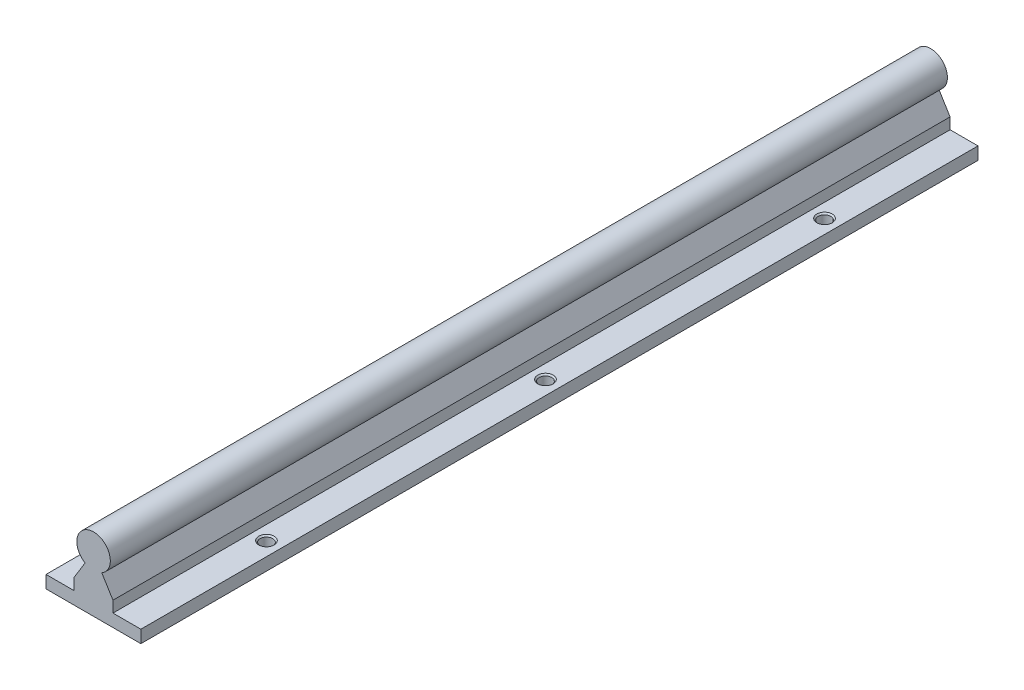
ISO-10303-21;
HEADER;
FILE_DESCRIPTION(('STEP AP214'),'2;1');
FILE_NAME('part.step','',(''),(''),'','','');
FILE_SCHEMA(('AUTOMOTIVE_DESIGN { 1 0 10303 214 1 1 1 1 }'));
ENDSEC;
DATA;
#1=APPLICATION_CONTEXT('core data for automotive mechanical design processes');
#2=APPLICATION_PROTOCOL_DEFINITION('international standard','automotive_design',2000,#1);
#3=PRODUCT_CONTEXT('',#1,'mechanical');
#4=PRODUCT('Part','Part','',(#3));
#5=PRODUCT_RELATED_PRODUCT_CATEGORY('part','',(#4));
#6=PRODUCT_DEFINITION_FORMATION('','',#4);
#7=PRODUCT_DEFINITION_CONTEXT('part definition',#1,'design');
#8=PRODUCT_DEFINITION('design','',#6,#7);
#9=PRODUCT_DEFINITION_SHAPE('','',#8);
#10=(LENGTH_UNIT() NAMED_UNIT(*) SI_UNIT(.MILLI.,.METRE.));
#11=(NAMED_UNIT(*) PLANE_ANGLE_UNIT() SI_UNIT($,.RADIAN.));
#12=(NAMED_UNIT(*) SI_UNIT($,.STERADIAN.) SOLID_ANGLE_UNIT());
#13=UNCERTAINTY_MEASURE_WITH_UNIT(LENGTH_MEASURE(1.E-05),#10,'distance_accuracy_value','');
#14=(GEOMETRIC_REPRESENTATION_CONTEXT(3) GLOBAL_UNCERTAINTY_ASSIGNED_CONTEXT((#13)) GLOBAL_UNIT_ASSIGNED_CONTEXT((#10,
#11,#12)) REPRESENTATION_CONTEXT('',''));
#15=CARTESIAN_POINT('',(0.,0.,0.));
#16=DIRECTION('',(0.,0.,1.));
#17=DIRECTION('',(1.,0.,0.));
#18=AXIS2_PLACEMENT_3D('',#15,#16,#17);
#19=CARTESIAN_POINT('',(-38.8854512776642,-15.3216429533087,300.));
#20=DIRECTION('',(1.,0.,0.));
#21=DIRECTION('',(0.,0.,-1.));
#22=AXIS2_PLACEMENT_3D('',#19,#20,#21);
#23=PLANE('',#22);
#24=DIRECTION('',(0.,-1.,0.));
#25=VECTOR('',#24,1.);
#26=CARTESIAN_POINT('',(-38.8854512776642,-15.3216429533087,0.));
#27=LINE('',#26,#25);
#28=CARTESIAN_POINT('',(-38.8854512776642,-15.3216429533087,0.));
#29=VERTEX_POINT('',#28);
#30=CARTESIAN_POINT('',(-38.8854512776642,-19.8216429533087,0.));
#31=VERTEX_POINT('',#30);
#32=EDGE_CURVE('E140',#29,#31,#27,.T.);
#33=ORIENTED_EDGE('',*,*,#32,.T.);
#34=DIRECTION('',(0.,0.,-1.));
#35=VECTOR('',#34,1.);
#36=CARTESIAN_POINT('',(-38.8854512776642,-19.8216429533087,300.));
#37=LINE('',#36,#35);
#38=CARTESIAN_POINT('',(-38.8854512776642,-19.8216429533087,300.));
#39=VERTEX_POINT('',#38);
#40=EDGE_CURVE('E11',#39,#31,#37,.T.);
#41=ORIENTED_EDGE('',*,*,#40,.F.);
#42=DIRECTION('',(0.,-1.,0.));
#43=VECTOR('',#42,1.);
#44=CARTESIAN_POINT('',(-38.8854512776642,-15.3216429533087,300.));
#45=LINE('',#44,#43);
#46=CARTESIAN_POINT('',(-38.8854512776642,-15.3216429533087,300.));
#47=VERTEX_POINT('',#46);
#48=EDGE_CURVE('E159',#47,#39,#45,.T.);
#49=ORIENTED_EDGE('',*,*,#48,.F.);
#50=DIRECTION('',(0.,0.,-1.));
#51=VECTOR('',#50,1.);
#52=CARTESIAN_POINT('',(-38.8854512776642,-15.3216429533087,300.));
#53=LINE('',#52,#51);
#54=EDGE_CURVE('E136',#47,#29,#53,.T.);
#55=ORIENTED_EDGE('',*,*,#54,.T.);
#56=EDGE_LOOP('',(#33,#41,#49,#55));
#57=FACE_BOUND('',#56,.T.);
#58=ADVANCED_FACE('F32',(#57),#23,.F.);
#59=CARTESIAN_POINT('',(-38.8854512776642,-19.8216429533087,300.));
#60=DIRECTION('',(0.,1.,0.));
#61=DIRECTION('',(0.,0.,1.));
#62=AXIS2_PLACEMENT_3D('',#59,#60,#61);
#63=PLANE('',#62);
#64=CARTESIAN_POINT('',(-33.8854512776642,-19.8216429533087,50.));
#65=DIRECTION('',(0.,1.,0.));
#66=DIRECTION('',(0.,0.,1.));
#67=AXIS2_PLACEMENT_3D('',#64,#65,#66);
#68=CIRCLE('',#67,2.25);
#69=CARTESIAN_POINT('',(-33.8854512776642,-19.8216429533087,52.25));
#70=VERTEX_POINT('',#69);
#71=EDGE_CURVE('E250',#70,#70,#68,.T.);
#72=ORIENTED_EDGE('',*,*,#71,.T.);
#73=EDGE_LOOP('',(#72));
#74=FACE_BOUND('',#73,.T.);
#75=CARTESIAN_POINT('',(-33.8854512776642,-19.8216429533087,150.));
#76=DIRECTION('',(0.,1.,0.));
#77=DIRECTION('',(0.,0.,1.));
#78=AXIS2_PLACEMENT_3D('',#75,#76,#77);
#79=CIRCLE('',#78,2.25);
#80=CARTESIAN_POINT('',(-33.8854512776642,-19.8216429533087,152.25));
#81=VERTEX_POINT('',#80);
#82=EDGE_CURVE('E241',#81,#81,#79,.T.);
#83=ORIENTED_EDGE('',*,*,#82,.T.);
#84=EDGE_LOOP('',(#83));
#85=FACE_BOUND('',#84,.T.);
#86=CARTESIAN_POINT('',(-33.8854512776642,-19.8216429533087,250.));
#87=DIRECTION('',(0.,1.,0.));
#88=DIRECTION('',(0.,0.,1.));
#89=AXIS2_PLACEMENT_3D('',#86,#87,#88);
#90=CIRCLE('',#89,2.25);
#91=CARTESIAN_POINT('',(-33.8854512776642,-19.8216429533087,252.25));
#92=VERTEX_POINT('',#91);
#93=EDGE_CURVE('E232',#92,#92,#90,.T.);
#94=ORIENTED_EDGE('',*,*,#93,.T.);
#95=EDGE_LOOP('',(#94));
#96=FACE_BOUND('',#95,.T.);
#97=CARTESIAN_POINT('',(-9.88545127766421,-19.8216429533087,250.));
#98=DIRECTION('',(0.,1.,0.));
#99=DIRECTION('',(0.,0.,1.));
#100=AXIS2_PLACEMENT_3D('',#97,#98,#99);
#101=CIRCLE('',#100,2.25);
#102=CARTESIAN_POINT('',(-9.88545127766421,-19.8216429533087,252.25));
#103=VERTEX_POINT('',#102);
#104=EDGE_CURVE('E223',#103,#103,#101,.T.);
#105=ORIENTED_EDGE('',*,*,#104,.T.);
#106=EDGE_LOOP('',(#105));
#107=FACE_BOUND('',#106,.T.);
#108=CARTESIAN_POINT('',(-9.88545127766421,-19.8216429533087,150.));
#109=DIRECTION('',(0.,1.,0.));
#110=DIRECTION('',(0.,0.,1.));
#111=AXIS2_PLACEMENT_3D('',#108,#109,#110);
#112=CIRCLE('',#111,2.25);
#113=CARTESIAN_POINT('',(-9.88545127766421,-19.8216429533087,152.25));
#114=VERTEX_POINT('',#113);
#115=EDGE_CURVE('E214',#114,#114,#112,.T.);
#116=ORIENTED_EDGE('',*,*,#115,.T.);
#117=EDGE_LOOP('',(#116));
#118=FACE_BOUND('',#117,.T.);
#119=CARTESIAN_POINT('',(-9.88545127766421,-19.8216429533087,50.));
#120=DIRECTION('',(0.,1.,0.));
#121=DIRECTION('',(0.,0.,1.));
#122=AXIS2_PLACEMENT_3D('',#119,#120,#121);
#123=CIRCLE('',#122,2.25);
#124=CARTESIAN_POINT('',(-9.88545127766421,-19.8216429533087,52.25));
#125=VERTEX_POINT('',#124);
#126=EDGE_CURVE('E144',#125,#125,#123,.T.);
#127=ORIENTED_EDGE('',*,*,#126,.T.);
#128=EDGE_LOOP('',(#127));
#129=FACE_BOUND('',#128,.T.);
#130=DIRECTION('',(1.,0.,0.));
#131=VECTOR('',#130,1.);
#132=CARTESIAN_POINT('',(-38.8854512776642,-19.8216429533087,0.));
#133=LINE('',#132,#131);
#134=CARTESIAN_POINT('',(-4.88545127766421,-19.8216429533087,0.));
#135=VERTEX_POINT('',#134);
#136=EDGE_CURVE('E143',#31,#135,#133,.T.);
#137=ORIENTED_EDGE('',*,*,#136,.T.);
#138=DIRECTION('',(0.,0.,-1.));
#139=VECTOR('',#138,1.);
#140=CARTESIAN_POINT('',(-4.88545127766421,-19.8216429533087,300.));
#141=LINE('',#140,#139);
#142=CARTESIAN_POINT('',(-4.88545127766421,-19.8216429533087,300.));
#143=VERTEX_POINT('',#142);
#144=EDGE_CURVE('E40',#143,#135,#141,.T.);
#145=ORIENTED_EDGE('',*,*,#144,.F.);
#146=DIRECTION('',(1.,0.,0.));
#147=VECTOR('',#146,1.);
#148=CARTESIAN_POINT('',(-38.8854512776642,-19.8216429533087,300.));
#149=LINE('',#148,#147);
#150=EDGE_CURVE('E97',#39,#143,#149,.T.);
#151=ORIENTED_EDGE('',*,*,#150,.F.);
#152=ORIENTED_EDGE('',*,*,#40,.T.);
#153=EDGE_LOOP('',(#137,#145,#151,#152));
#154=FACE_BOUND('',#153,.T.);
#155=ADVANCED_FACE('F288',(#74,#85,#96,#107,#118,#129,#154),#63,.F.);
#156=CARTESIAN_POINT('',(-4.88545127766421,-19.8216429533087,300.));
#157=DIRECTION('',(-1.,0.,0.));
#158=DIRECTION('',(0.,0.,1.));
#159=AXIS2_PLACEMENT_3D('',#156,#157,#158);
#160=PLANE('',#159);
#161=DIRECTION('',(0.,1.,0.));
#162=VECTOR('',#161,1.);
#163=CARTESIAN_POINT('',(-4.88545127766421,-19.8216429533087,0.));
#164=LINE('',#163,#162);
#165=CARTESIAN_POINT('',(-4.88545127766421,-15.3216429533087,0.));
#166=VERTEX_POINT('',#165);
#167=EDGE_CURVE('E146',#135,#166,#164,.T.);
#168=ORIENTED_EDGE('',*,*,#167,.T.);
#169=DIRECTION('',(0.,0.,-1.));
#170=VECTOR('',#169,1.);
#171=CARTESIAN_POINT('',(-4.88545127766421,-15.3216429533087,300.));
#172=LINE('',#171,#170);
#173=CARTESIAN_POINT('',(-4.88545127766421,-15.3216429533087,300.));
#174=VERTEX_POINT('',#173);
#175=EDGE_CURVE('E172',#174,#166,#172,.T.);
#176=ORIENTED_EDGE('',*,*,#175,.F.);
#177=DIRECTION('',(0.,1.,0.));
#178=VECTOR('',#177,1.);
#179=CARTESIAN_POINT('',(-4.88545127766421,-19.8216429533087,300.));
#180=LINE('',#179,#178);
#181=EDGE_CURVE('E180',#143,#174,#180,.T.);
#182=ORIENTED_EDGE('',*,*,#181,.F.);
#183=ORIENTED_EDGE('',*,*,#144,.T.);
#184=EDGE_LOOP('',(#168,#176,#182,#183));
#185=FACE_BOUND('',#184,.T.);
#186=ADVANCED_FACE('F178',(#185),#160,.F.);
#187=CARTESIAN_POINT('',(-4.88545127766421,-15.3216429533087,300.));
#188=DIRECTION('',(0.,-1.,0.));
#189=DIRECTION('',(0.,0.,-1.));
#190=AXIS2_PLACEMENT_3D('',#187,#188,#189);
#191=PLANE('',#190);
#192=CARTESIAN_POINT('',(-9.88545127766421,-15.3216429533087,250.));
#193=DIRECTION('',(0.,1.,0.));
#194=DIRECTION('',(0.,0.,1.));
#195=AXIS2_PLACEMENT_3D('',#192,#193,#194);
#196=CIRCLE('',#195,2.75);
#197=CARTESIAN_POINT('',(-9.88545127766421,-15.3216429533087,252.75));
#198=VERTEX_POINT('',#197);
#199=EDGE_CURVE('E229',#198,#198,#196,.T.);
#200=ORIENTED_EDGE('',*,*,#199,.F.);
#201=EDGE_LOOP('',(#200));
#202=FACE_BOUND('',#201,.T.);
#203=CARTESIAN_POINT('',(-9.88545127766421,-15.3216429533087,150.));
#204=DIRECTION('',(0.,1.,0.));
#205=DIRECTION('',(0.,0.,1.));
#206=AXIS2_PLACEMENT_3D('',#203,#204,#205);
#207=CIRCLE('',#206,2.75);
#208=CARTESIAN_POINT('',(-9.88545127766421,-15.3216429533087,152.75));
#209=VERTEX_POINT('',#208);
#210=EDGE_CURVE('E220',#209,#209,#207,.T.);
#211=ORIENTED_EDGE('',*,*,#210,.F.);
#212=EDGE_LOOP('',(#211));
#213=FACE_BOUND('',#212,.T.);
#214=CARTESIAN_POINT('',(-9.88545127766421,-15.3216429533087,50.));
#215=DIRECTION('',(0.,1.,0.));
#216=DIRECTION('',(0.,0.,1.));
#217=AXIS2_PLACEMENT_3D('',#214,#215,#216);
#218=CIRCLE('',#217,2.75);
#219=CARTESIAN_POINT('',(-9.88545127766421,-15.3216429533087,52.75));
#220=VERTEX_POINT('',#219);
#221=EDGE_CURVE('E211',#220,#220,#218,.T.);
#222=ORIENTED_EDGE('',*,*,#221,.F.);
#223=EDGE_LOOP('',(#222));
#224=FACE_BOUND('',#223,.T.);
#225=DIRECTION('',(-1.,0.,0.));
#226=VECTOR('',#225,1.);
#227=CARTESIAN_POINT('',(-4.88545127766421,-15.3216429533087,0.));
#228=LINE('',#227,#226);
#229=CARTESIAN_POINT('',(-14.8854512776642,-15.3216429533087,0.));
#230=VERTEX_POINT('',#229);
#231=EDGE_CURVE('E148',#166,#230,#228,.T.);
#232=ORIENTED_EDGE('',*,*,#231,.T.);
#233=DIRECTION('',(0.,0.,-1.));
#234=VECTOR('',#233,1.);
#235=CARTESIAN_POINT('',(-14.8854512776642,-15.3216429533087,300.));
#236=LINE('',#235,#234);
#237=CARTESIAN_POINT('',(-14.8854512776642,-15.3216429533087,300.));
#238=VERTEX_POINT('',#237);
#239=EDGE_CURVE('E169',#238,#230,#236,.T.);
#240=ORIENTED_EDGE('',*,*,#239,.F.);
#241=DIRECTION('',(-1.,0.,0.));
#242=VECTOR('',#241,1.);
#243=CARTESIAN_POINT('',(-4.88545127766421,-15.3216429533087,300.));
#244=LINE('',#243,#242);
#245=EDGE_CURVE('E198',#174,#238,#244,.T.);
#246=ORIENTED_EDGE('',*,*,#245,.F.);
#247=ORIENTED_EDGE('',*,*,#175,.T.);
#248=EDGE_LOOP('',(#232,#240,#246,#247));
#249=FACE_BOUND('',#248,.T.);
#250=ADVANCED_FACE('F189',(#202,#213,#224,#249),#191,.F.);
#251=CARTESIAN_POINT('',(-14.8854512776642,-15.3216429533087,300.));
#252=DIRECTION('',(-1.,0.,0.));
#253=DIRECTION('',(0.,-1.,0.));
#254=AXIS2_PLACEMENT_3D('',#251,#252,#253);
#255=PLANE('',#254);
#256=DIRECTION('',(0.,1.,0.));
#257=VECTOR('',#256,1.);
#258=CARTESIAN_POINT('',(-14.8854512776642,-15.3216429533087,0.));
#259=LINE('',#258,#257);
#260=CARTESIAN_POINT('',(-14.8854512776642,-11.3216429533087,0.));
#261=VERTEX_POINT('',#260);
#262=EDGE_CURVE('E150',#230,#261,#259,.T.);
#263=ORIENTED_EDGE('',*,*,#262,.T.);
#264=DIRECTION('',(0.,0.,-1.));
#265=VECTOR('',#264,1.);
#266=CARTESIAN_POINT('',(-14.8854512776642,-11.3216429533087,300.));
#267=LINE('',#266,#265);
#268=CARTESIAN_POINT('',(-14.8854512776642,-11.3216429533087,300.));
#269=VERTEX_POINT('',#268);
#270=EDGE_CURVE('E166',#269,#261,#267,.T.);
#271=ORIENTED_EDGE('',*,*,#270,.F.);
#272=DIRECTION('',(0.,1.,0.));
#273=VECTOR('',#272,1.);
#274=CARTESIAN_POINT('',(-14.8854512776642,-15.3216429533087,300.));
#275=LINE('',#274,#273);
#276=EDGE_CURVE('E195',#238,#269,#275,.T.);
#277=ORIENTED_EDGE('',*,*,#276,.F.);
#278=ORIENTED_EDGE('',*,*,#239,.T.);
#279=EDGE_LOOP('',(#263,#271,#277,#278));
#280=FACE_BOUND('',#279,.T.);
#281=ADVANCED_FACE('F193',(#280),#255,.F.);
#282=CARTESIAN_POINT('',(-14.8854512776642,-11.3216429533087,300.));
#283=DIRECTION('',(-0.851658316704544,-0.524097425664335,0.));
#284=DIRECTION('',(0.524097425664335,-0.851658316704544,0.));
#285=AXIS2_PLACEMENT_3D('',#282,#283,#284);
#286=PLANE('',#285);
#287=DIRECTION('',(-0.524097425664335,0.851658316704544,0.));
#288=VECTOR('',#287,1.);
#289=CARTESIAN_POINT('',(-14.8854512776642,-11.3216429533087,0.));
#290=LINE('',#289,#288);
#291=CARTESIAN_POINT('',(-18.8854512776642,-4.82164295330865,0.));
#292=VERTEX_POINT('',#291);
#293=EDGE_CURVE('E152',#261,#292,#290,.T.);
#294=ORIENTED_EDGE('',*,*,#293,.T.);
#295=DIRECTION('',(0.,0.,-1.));
#296=VECTOR('',#295,1.);
#297=CARTESIAN_POINT('',(-18.8854512776642,-4.82164295330865,300.));
#298=LINE('',#297,#296);
#299=CARTESIAN_POINT('',(-18.8854512776642,-4.82164295330865,300.));
#300=VERTEX_POINT('',#299);
#301=EDGE_CURVE('E163',#300,#292,#298,.T.);
#302=ORIENTED_EDGE('',*,*,#301,.F.);
#303=DIRECTION('',(-0.524097425664335,0.851658316704544,0.));
#304=VECTOR('',#303,1.);
#305=CARTESIAN_POINT('',(-14.8854512776642,-11.3216429533087,300.));
#306=LINE('',#305,#304);
#307=EDGE_CURVE('E197',#269,#300,#306,.T.);
#308=ORIENTED_EDGE('',*,*,#307,.F.);
#309=ORIENTED_EDGE('',*,*,#270,.T.);
#310=EDGE_LOOP('',(#294,#302,#308,#309));
#311=FACE_BOUND('',#310,.T.);
#312=ADVANCED_FACE('F301',(#311),#286,.F.);
#313=CARTESIAN_POINT('',(-21.8398824938442,0.40055353752367,300.));
#314=DIRECTION('',(0.,0.,-1.));
#315=DIRECTION('',(-1.,0.,0.));
#316=AXIS2_PLACEMENT_3D('',#313,#314,#315);
#317=CYLINDRICAL_SURFACE('',#316,6.);
#318=CARTESIAN_POINT('',(-21.8398824938442,0.40055353752367,0.));
#319=DIRECTION('',(0.,0.,1.));
#320=DIRECTION('',(1.,0.,0.));
#321=AXIS2_PLACEMENT_3D('',#318,#319,#320);
#322=CIRCLE('',#321,6.);
#323=CARTESIAN_POINT('',(-24.8854512776642,-4.76902195597876,0.));
#324=VERTEX_POINT('',#323);
#325=EDGE_CURVE('E154',#292,#324,#322,.T.);
#326=ORIENTED_EDGE('',*,*,#325,.T.);
#327=DIRECTION('',(0.,0.,-1.));
#328=VECTOR('',#327,1.);
#329=CARTESIAN_POINT('',(-24.8854512776642,-4.76902195597876,300.));
#330=LINE('',#329,#328);
#331=CARTESIAN_POINT('',(-24.8854512776642,-4.76902195597876,300.));
#332=VERTEX_POINT('',#331);
#333=EDGE_CURVE('E131',#332,#324,#330,.T.);
#334=ORIENTED_EDGE('',*,*,#333,.F.);
#335=CARTESIAN_POINT('',(-21.8398824938442,0.40055353752367,300.));
#336=DIRECTION('',(0.,0.,1.));
#337=DIRECTION('',(1.,0.,0.));
#338=AXIS2_PLACEMENT_3D('',#335,#336,#337);
#339=CIRCLE('',#338,6.);
#340=EDGE_CURVE('E122',#300,#332,#339,.T.);
#341=ORIENTED_EDGE('',*,*,#340,.F.);
#342=ORIENTED_EDGE('',*,*,#301,.T.);
#343=EDGE_LOOP('',(#326,#334,#341,#342));
#344=FACE_BOUND('',#343,.T.);
#345=ADVANCED_FACE('F298',(#344),#317,.T.);
#346=CARTESIAN_POINT('',(-24.8854512776642,-4.76902195597876,300.));
#347=DIRECTION('',(0.853535558568587,-0.521034596028912,0.));
#348=DIRECTION('',(0.521034596028912,0.853535558568587,0.));
#349=AXIS2_PLACEMENT_3D('',#346,#347,#348);
#350=PLANE('',#349);
#351=DIRECTION('',(-0.521034596028912,-0.853535558568586,0.));
#352=VECTOR('',#351,1.);
#353=CARTESIAN_POINT('',(-24.8854512776642,-4.76902195597876,0.));
#354=LINE('',#353,#352);
#355=CARTESIAN_POINT('',(-28.8854512776642,-11.3216429533087,0.));
#356=VERTEX_POINT('',#355);
#357=EDGE_CURVE('E130',#324,#356,#354,.T.);
#358=ORIENTED_EDGE('',*,*,#357,.T.);
#359=DIRECTION('',(0.,0.,-1.));
#360=VECTOR('',#359,1.);
#361=CARTESIAN_POINT('',(-28.8854512776642,-11.3216429533087,300.));
#362=LINE('',#361,#360);
#363=CARTESIAN_POINT('',(-28.8854512776642,-11.3216429533087,300.));
#364=VERTEX_POINT('',#363);
#365=EDGE_CURVE('E127',#364,#356,#362,.T.);
#366=ORIENTED_EDGE('',*,*,#365,.F.);
#367=DIRECTION('',(-0.521034596028912,-0.853535558568586,0.));
#368=VECTOR('',#367,1.);
#369=CARTESIAN_POINT('',(-24.8854512776642,-4.76902195597876,300.));
#370=LINE('',#369,#368);
#371=EDGE_CURVE('E116',#332,#364,#370,.T.);
#372=ORIENTED_EDGE('',*,*,#371,.F.);
#373=ORIENTED_EDGE('',*,*,#333,.T.);
#374=EDGE_LOOP('',(#358,#366,#372,#373));
#375=FACE_BOUND('',#374,.T.);
#376=ADVANCED_FACE('F128',(#375),#350,.F.);
#377=CARTESIAN_POINT('',(-28.8854512776642,-11.3216429533087,300.));
#378=DIRECTION('',(1.,0.,0.));
#379=DIRECTION('',(0.,0.,-1.));
#380=AXIS2_PLACEMENT_3D('',#377,#378,#379);
#381=PLANE('',#380);
#382=DIRECTION('',(0.,-1.,0.));
#383=VECTOR('',#382,1.);
#384=CARTESIAN_POINT('',(-28.8854512776642,-11.3216429533087,0.));
#385=LINE('',#384,#383);
#386=CARTESIAN_POINT('',(-28.8854512776642,-15.3216429533087,0.));
#387=VERTEX_POINT('',#386);
#388=EDGE_CURVE('E83',#356,#387,#385,.T.);
#389=ORIENTED_EDGE('',*,*,#388,.T.);
#390=DIRECTION('',(0.,0.,-1.));
#391=VECTOR('',#390,1.);
#392=CARTESIAN_POINT('',(-28.8854512776642,-15.3216429533087,300.));
#393=LINE('',#392,#391);
#394=CARTESIAN_POINT('',(-28.8854512776642,-15.3216429533087,300.));
#395=VERTEX_POINT('',#394);
#396=EDGE_CURVE('E132',#395,#387,#393,.T.);
#397=ORIENTED_EDGE('',*,*,#396,.F.);
#398=DIRECTION('',(0.,-1.,0.));
#399=VECTOR('',#398,1.);
#400=CARTESIAN_POINT('',(-28.8854512776642,-11.3216429533087,300.));
#401=LINE('',#400,#399);
#402=EDGE_CURVE('E120',#364,#395,#401,.T.);
#403=ORIENTED_EDGE('',*,*,#402,.F.);
#404=ORIENTED_EDGE('',*,*,#365,.T.);
#405=EDGE_LOOP('',(#389,#397,#403,#404));
#406=FACE_BOUND('',#405,.T.);
#407=ADVANCED_FACE('F134',(#406),#381,.F.);
#408=CARTESIAN_POINT('',(-28.8854512776642,-15.3216429533087,300.));
#409=DIRECTION('',(0.,-1.,0.));
#410=DIRECTION('',(1.,0.,0.));
#411=AXIS2_PLACEMENT_3D('',#408,#409,#410);
#412=PLANE('',#411);
#413=CARTESIAN_POINT('',(-33.8854512776642,-15.3216429533087,50.));
#414=DIRECTION('',(0.,1.,0.));
#415=DIRECTION('',(0.,0.,1.));
#416=AXIS2_PLACEMENT_3D('',#413,#414,#415);
#417=CIRCLE('',#416,2.75);
#418=CARTESIAN_POINT('',(-33.8854512776642,-15.3216429533087,52.75));
#419=VERTEX_POINT('',#418);
#420=EDGE_CURVE('E256',#419,#419,#417,.T.);
#421=ORIENTED_EDGE('',*,*,#420,.F.);
#422=EDGE_LOOP('',(#421));
#423=FACE_BOUND('',#422,.T.);
#424=CARTESIAN_POINT('',(-33.8854512776642,-15.3216429533087,150.));
#425=DIRECTION('',(0.,1.,0.));
#426=DIRECTION('',(0.,0.,1.));
#427=AXIS2_PLACEMENT_3D('',#424,#425,#426);
#428=CIRCLE('',#427,2.75);
#429=CARTESIAN_POINT('',(-33.8854512776642,-15.3216429533087,152.75));
#430=VERTEX_POINT('',#429);
#431=EDGE_CURVE('E247',#430,#430,#428,.T.);
#432=ORIENTED_EDGE('',*,*,#431,.F.);
#433=EDGE_LOOP('',(#432));
#434=FACE_BOUND('',#433,.T.);
#435=CARTESIAN_POINT('',(-33.8854512776642,-15.3216429533087,250.));
#436=DIRECTION('',(0.,1.,0.));
#437=DIRECTION('',(0.,0.,1.));
#438=AXIS2_PLACEMENT_3D('',#435,#436,#437);
#439=CIRCLE('',#438,2.75);
#440=CARTESIAN_POINT('',(-33.8854512776642,-15.3216429533087,252.75));
#441=VERTEX_POINT('',#440);
#442=EDGE_CURVE('E238',#441,#441,#439,.T.);
#443=ORIENTED_EDGE('',*,*,#442,.F.);
#444=EDGE_LOOP('',(#443));
#445=FACE_BOUND('',#444,.T.);
#446=DIRECTION('',(-1.,0.,0.));
#447=VECTOR('',#446,1.);
#448=CARTESIAN_POINT('',(-28.8854512776642,-15.3216429533087,0.));
#449=LINE('',#448,#447);
#450=EDGE_CURVE('E89',#387,#29,#449,.T.);
#451=ORIENTED_EDGE('',*,*,#450,.T.);
#452=ORIENTED_EDGE('',*,*,#54,.F.);
#453=DIRECTION('',(-1.,0.,0.));
#454=VECTOR('',#453,1.);
#455=CARTESIAN_POINT('',(-28.8854512776642,-15.3216429533087,300.));
#456=LINE('',#455,#454);
#457=EDGE_CURVE('E48',#395,#47,#456,.T.);
#458=ORIENTED_EDGE('',*,*,#457,.F.);
#459=ORIENTED_EDGE('',*,*,#396,.T.);
#460=EDGE_LOOP('',(#451,#452,#458,#459));
#461=FACE_BOUND('',#460,.T.);
#462=ADVANCED_FACE('F262',(#423,#434,#445,#461),#412,.F.);
#463=CARTESIAN_POINT('',(-21.8398824938442,0.40055353752367,300.));
#464=DIRECTION('',(0.,0.,1.));
#465=DIRECTION('',(1.,0.,0.));
#466=AXIS2_PLACEMENT_3D('',#463,#464,#465);
#467=PLANE('',#466);
#468=ORIENTED_EDGE('',*,*,#48,.T.);
#469=ORIENTED_EDGE('',*,*,#150,.T.);
#470=ORIENTED_EDGE('',*,*,#181,.T.);
#471=ORIENTED_EDGE('',*,*,#245,.T.);
#472=ORIENTED_EDGE('',*,*,#276,.T.);
#473=ORIENTED_EDGE('',*,*,#307,.T.);
#474=ORIENTED_EDGE('',*,*,#340,.T.);
#475=ORIENTED_EDGE('',*,*,#371,.T.);
#476=ORIENTED_EDGE('',*,*,#402,.T.);
#477=ORIENTED_EDGE('',*,*,#457,.T.);
#478=EDGE_LOOP('',(#468,#469,#470,#471,#472,#473,#474,#475,#476,#477));
#479=FACE_BOUND('',#478,.T.);
#480=ADVANCED_FACE('F118',(#479),#467,.T.);
#481=CARTESIAN_POINT('',(-21.8398824938442,0.40055353752367,0.));
#482=DIRECTION('',(0.,0.,1.));
#483=DIRECTION('',(1.,0.,0.));
#484=AXIS2_PLACEMENT_3D('',#481,#482,#483);
#485=PLANE('',#484);
#486=ORIENTED_EDGE('',*,*,#32,.F.);
#487=ORIENTED_EDGE('',*,*,#450,.F.);
#488=ORIENTED_EDGE('',*,*,#388,.F.);
#489=ORIENTED_EDGE('',*,*,#357,.F.);
#490=ORIENTED_EDGE('',*,*,#325,.F.);
#491=ORIENTED_EDGE('',*,*,#293,.F.);
#492=ORIENTED_EDGE('',*,*,#262,.F.);
#493=ORIENTED_EDGE('',*,*,#231,.F.);
#494=ORIENTED_EDGE('',*,*,#167,.F.);
#495=ORIENTED_EDGE('',*,*,#136,.F.);
#496=EDGE_LOOP('',(#486,#487,#488,#489,#490,#491,#492,#493,#494,#495));
#497=FACE_BOUND('',#496,.T.);
#498=ADVANCED_FACE('F184',(#497),#485,.F.);
#499=CARTESIAN_POINT('',(-9.88545127766421,-15.3216429533087,50.));
#500=DIRECTION('',(0.,1.,0.));
#501=DIRECTION('',(0.,0.,1.));
#502=AXIS2_PLACEMENT_3D('',#499,#500,#501);
#503=CYLINDRICAL_SURFACE('',#502,2.25);
#504=ORIENTED_EDGE('',*,*,#126,.F.);
#505=EDGE_LOOP('',(#504));
#506=FACE_BOUND('',#505,.T.);
#507=CARTESIAN_POINT('',(-9.88545127766421,-15.8216429533087,50.));
#508=DIRECTION('',(0.,1.,0.));
#509=DIRECTION('',(0.,0.,1.));
#510=AXIS2_PLACEMENT_3D('',#507,#508,#509);
#511=CIRCLE('',#510,2.25);
#512=CARTESIAN_POINT('',(-9.88545127766421,-15.8216429533087,52.25));
#513=VERTEX_POINT('',#512);
#514=EDGE_CURVE('E208',#513,#513,#511,.T.);
#515=ORIENTED_EDGE('',*,*,#514,.T.);
#516=EDGE_LOOP('',(#515));
#517=FACE_BOUND('',#516,.T.);
#518=ADVANCED_FACE('F371',(#506,#517),#503,.F.);
#519=CARTESIAN_POINT('',(-9.88545127766421,-15.3216429533087,50.));
#520=DIRECTION('',(0.,1.,0.));
#521=DIRECTION('',(0.,0.,1.));
#522=AXIS2_PLACEMENT_3D('',#519,#520,#521);
#523=CONICAL_SURFACE('',#522,2.75,0.785398163397446);
#524=ORIENTED_EDGE('',*,*,#514,.F.);
#525=EDGE_LOOP('',(#524));
#526=FACE_BOUND('',#525,.T.);
#527=ORIENTED_EDGE('',*,*,#221,.T.);
#528=EDGE_LOOP('',(#527));
#529=FACE_BOUND('',#528,.T.);
#530=ADVANCED_FACE('F393',(#526,#529),#523,.F.);
#531=CARTESIAN_POINT('',(-9.88545127766421,-15.3216429533087,150.));
#532=DIRECTION('',(0.,1.,0.));
#533=DIRECTION('',(0.,0.,1.));
#534=AXIS2_PLACEMENT_3D('',#531,#532,#533);
#535=CYLINDRICAL_SURFACE('',#534,2.25);
#536=ORIENTED_EDGE('',*,*,#115,.F.);
#537=EDGE_LOOP('',(#536));
#538=FACE_BOUND('',#537,.T.);
#539=CARTESIAN_POINT('',(-9.88545127766421,-15.8216429533087,150.));
#540=DIRECTION('',(0.,1.,0.));
#541=DIRECTION('',(0.,0.,1.));
#542=AXIS2_PLACEMENT_3D('',#539,#540,#541);
#543=CIRCLE('',#542,2.25);
#544=CARTESIAN_POINT('',(-9.88545127766421,-15.8216429533087,152.25));
#545=VERTEX_POINT('',#544);
#546=EDGE_CURVE('E217',#545,#545,#543,.T.);
#547=ORIENTED_EDGE('',*,*,#546,.T.);
#548=EDGE_LOOP('',(#547));
#549=FACE_BOUND('',#548,.T.);
#550=ADVANCED_FACE('F400',(#538,#549),#535,.F.);
#551=CARTESIAN_POINT('',(-9.88545127766421,-15.3216429533087,150.));
#552=DIRECTION('',(0.,1.,0.));
#553=DIRECTION('',(0.,0.,1.));
#554=AXIS2_PLACEMENT_3D('',#551,#552,#553);
#555=CONICAL_SURFACE('',#554,2.75,0.785398163397446);
#556=ORIENTED_EDGE('',*,*,#546,.F.);
#557=EDGE_LOOP('',(#556));
#558=FACE_BOUND('',#557,.T.);
#559=ORIENTED_EDGE('',*,*,#210,.T.);
#560=EDGE_LOOP('',(#559));
#561=FACE_BOUND('',#560,.T.);
#562=ADVANCED_FACE('F408',(#558,#561),#555,.F.);
#563=CARTESIAN_POINT('',(-9.88545127766421,-15.3216429533087,250.));
#564=DIRECTION('',(0.,1.,0.));
#565=DIRECTION('',(0.,0.,1.));
#566=AXIS2_PLACEMENT_3D('',#563,#564,#565);
#567=CYLINDRICAL_SURFACE('',#566,2.25);
#568=ORIENTED_EDGE('',*,*,#104,.F.);
#569=EDGE_LOOP('',(#568));
#570=FACE_BOUND('',#569,.T.);
#571=CARTESIAN_POINT('',(-9.88545127766421,-15.8216429533087,250.));
#572=DIRECTION('',(0.,1.,0.));
#573=DIRECTION('',(0.,0.,1.));
#574=AXIS2_PLACEMENT_3D('',#571,#572,#573);
#575=CIRCLE('',#574,2.25);
#576=CARTESIAN_POINT('',(-9.88545127766421,-15.8216429533087,252.25));
#577=VERTEX_POINT('',#576);
#578=EDGE_CURVE('E226',#577,#577,#575,.T.);
#579=ORIENTED_EDGE('',*,*,#578,.T.);
#580=EDGE_LOOP('',(#579));
#581=FACE_BOUND('',#580,.T.);
#582=ADVANCED_FACE('F416',(#570,#581),#567,.F.);
#583=CARTESIAN_POINT('',(-9.88545127766421,-15.3216429533087,250.));
#584=DIRECTION('',(0.,1.,0.));
#585=DIRECTION('',(0.,0.,1.));
#586=AXIS2_PLACEMENT_3D('',#583,#584,#585);
#587=CONICAL_SURFACE('',#586,2.75,0.785398163397446);
#588=ORIENTED_EDGE('',*,*,#578,.F.);
#589=EDGE_LOOP('',(#588));
#590=FACE_BOUND('',#589,.T.);
#591=ORIENTED_EDGE('',*,*,#199,.T.);
#592=EDGE_LOOP('',(#591));
#593=FACE_BOUND('',#592,.T.);
#594=ADVANCED_FACE('F283',(#590,#593),#587,.F.);
#595=CARTESIAN_POINT('',(-33.8854512776642,-15.3216429533087,250.));
#596=DIRECTION('',(0.,1.,0.));
#597=DIRECTION('',(0.,0.,1.));
#598=AXIS2_PLACEMENT_3D('',#595,#596,#597);
#599=CYLINDRICAL_SURFACE('',#598,2.25);
#600=ORIENTED_EDGE('',*,*,#93,.F.);
#601=EDGE_LOOP('',(#600));
#602=FACE_BOUND('',#601,.T.);
#603=CARTESIAN_POINT('',(-33.8854512776642,-15.8216429533087,250.));
#604=DIRECTION('',(0.,1.,0.));
#605=DIRECTION('',(0.,0.,1.));
#606=AXIS2_PLACEMENT_3D('',#603,#604,#605);
#607=CIRCLE('',#606,2.25);
#608=CARTESIAN_POINT('',(-33.8854512776642,-15.8216429533087,252.25));
#609=VERTEX_POINT('',#608);
#610=EDGE_CURVE('E235',#609,#609,#607,.T.);
#611=ORIENTED_EDGE('',*,*,#610,.T.);
#612=EDGE_LOOP('',(#611));
#613=FACE_BOUND('',#612,.T.);
#614=ADVANCED_FACE('F273',(#602,#613),#599,.F.);
#615=CARTESIAN_POINT('',(-33.8854512776642,-15.3216429533087,250.));
#616=DIRECTION('',(0.,1.,0.));
#617=DIRECTION('',(0.,0.,1.));
#618=AXIS2_PLACEMENT_3D('',#615,#616,#617);
#619=CONICAL_SURFACE('',#618,2.75,0.785398163397445);
#620=ORIENTED_EDGE('',*,*,#610,.F.);
#621=EDGE_LOOP('',(#620));
#622=FACE_BOUND('',#621,.T.);
#623=ORIENTED_EDGE('',*,*,#442,.T.);
#624=EDGE_LOOP('',(#623));
#625=FACE_BOUND('',#624,.T.);
#626=ADVANCED_FACE('F270',(#622,#625),#619,.F.);
#627=CARTESIAN_POINT('',(-33.8854512776642,-15.3216429533087,150.));
#628=DIRECTION('',(0.,1.,0.));
#629=DIRECTION('',(0.,0.,1.));
#630=AXIS2_PLACEMENT_3D('',#627,#628,#629);
#631=CYLINDRICAL_SURFACE('',#630,2.25);
#632=ORIENTED_EDGE('',*,*,#82,.F.);
#633=EDGE_LOOP('',(#632));
#634=FACE_BOUND('',#633,.T.);
#635=CARTESIAN_POINT('',(-33.8854512776642,-15.8216429533087,150.));
#636=DIRECTION('',(0.,1.,0.));
#637=DIRECTION('',(0.,0.,1.));
#638=AXIS2_PLACEMENT_3D('',#635,#636,#637);
#639=CIRCLE('',#638,2.25);
#640=CARTESIAN_POINT('',(-33.8854512776642,-15.8216429533087,152.25));
#641=VERTEX_POINT('',#640);
#642=EDGE_CURVE('E244',#641,#641,#639,.T.);
#643=ORIENTED_EDGE('',*,*,#642,.T.);
#644=EDGE_LOOP('',(#643));
#645=FACE_BOUND('',#644,.T.);
#646=ADVANCED_FACE('F272',(#634,#645),#631,.F.);
#647=CARTESIAN_POINT('',(-33.8854512776642,-15.3216429533087,150.));
#648=DIRECTION('',(0.,1.,0.));
#649=DIRECTION('',(0.,0.,1.));
#650=AXIS2_PLACEMENT_3D('',#647,#648,#649);
#651=CONICAL_SURFACE('',#650,2.75,0.785398163397445);
#652=ORIENTED_EDGE('',*,*,#642,.F.);
#653=EDGE_LOOP('',(#652));
#654=FACE_BOUND('',#653,.T.);
#655=ORIENTED_EDGE('',*,*,#431,.T.);
#656=EDGE_LOOP('',(#655));
#657=FACE_BOUND('',#656,.T.);
#658=ADVANCED_FACE('F280',(#654,#657),#651,.F.);
#659=CARTESIAN_POINT('',(-33.8854512776642,-15.3216429533087,50.));
#660=DIRECTION('',(0.,1.,0.));
#661=DIRECTION('',(0.,0.,1.));
#662=AXIS2_PLACEMENT_3D('',#659,#660,#661);
#663=CYLINDRICAL_SURFACE('',#662,2.25);
#664=ORIENTED_EDGE('',*,*,#71,.F.);
#665=EDGE_LOOP('',(#664));
#666=FACE_BOUND('',#665,.T.);
#667=CARTESIAN_POINT('',(-33.8854512776642,-15.8216429533087,50.));
#668=DIRECTION('',(0.,1.,0.));
#669=DIRECTION('',(0.,0.,1.));
#670=AXIS2_PLACEMENT_3D('',#667,#668,#669);
#671=CIRCLE('',#670,2.25);
#672=CARTESIAN_POINT('',(-33.8854512776642,-15.8216429533087,52.25));
#673=VERTEX_POINT('',#672);
#674=EDGE_CURVE('E253',#673,#673,#671,.T.);
#675=ORIENTED_EDGE('',*,*,#674,.T.);
#676=EDGE_LOOP('',(#675));
#677=FACE_BOUND('',#676,.T.);
#678=ADVANCED_FACE('F455',(#666,#677),#663,.F.);
#679=CARTESIAN_POINT('',(-33.8854512776642,-15.3216429533087,50.));
#680=DIRECTION('',(0.,1.,0.));
#681=DIRECTION('',(0.,0.,1.));
#682=AXIS2_PLACEMENT_3D('',#679,#680,#681);
#683=CONICAL_SURFACE('',#682,2.75,0.785398163397445);
#684=ORIENTED_EDGE('',*,*,#674,.F.);
#685=EDGE_LOOP('',(#684));
#686=FACE_BOUND('',#685,.T.);
#687=ORIENTED_EDGE('',*,*,#420,.T.);
#688=EDGE_LOOP('',(#687));
#689=FACE_BOUND('',#688,.T.);
#690=ADVANCED_FACE('F260',(#686,#689),#683,.F.);
#691=CLOSED_SHELL('',(#58,#155,#186,#250,#281,#312,#345,#376,#407,#462,#480,#498,#518,#530,#550,
#562,#582,#594,#614,#626,#646,#658,#678,#690));
#692=MANIFOLD_SOLID_BREP('B2',#691);
#693=ADVANCED_BREP_SHAPE_REPRESENTATION('',(#18,#692),#14);
#694=SHAPE_DEFINITION_REPRESENTATION(#9,#693);
ENDSEC;
END-ISO-10303-21;
